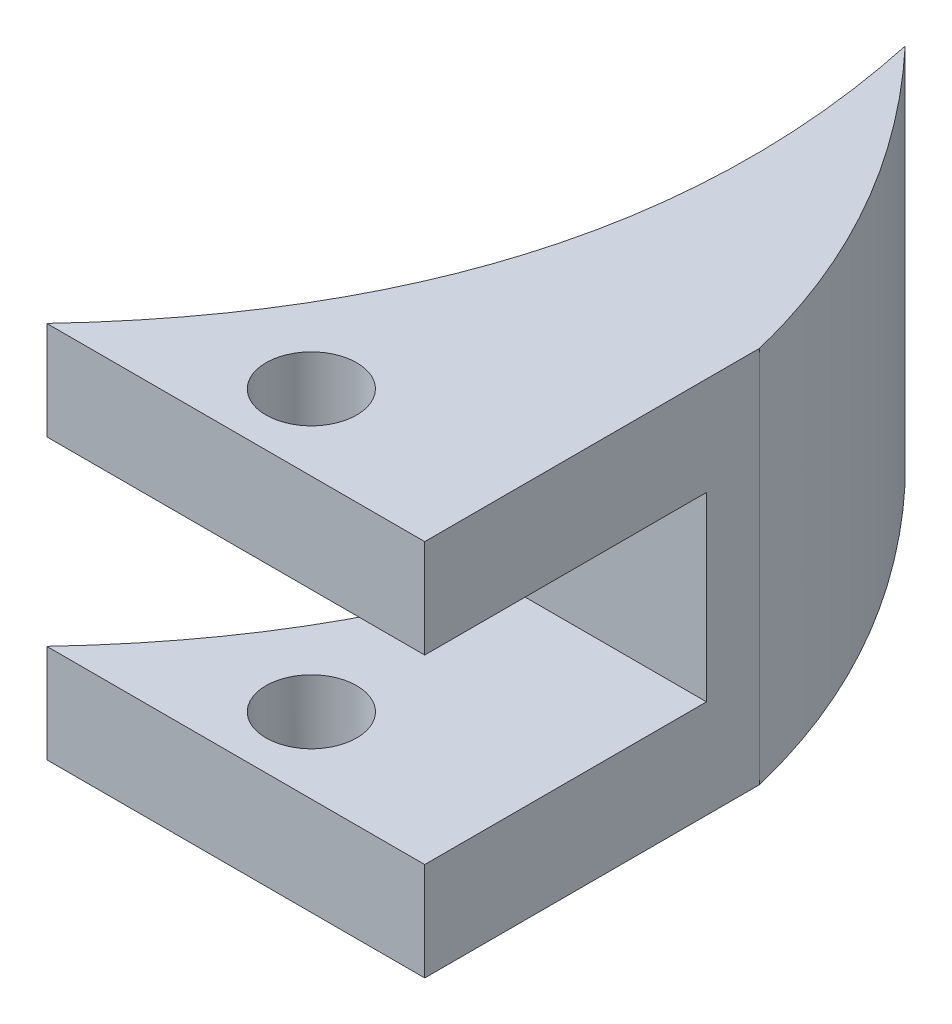
ISO-10303-21;
HEADER;
FILE_DESCRIPTION(('STEP AP214'),'2;1');
FILE_NAME('part.step','',(''),(''),'','','');
FILE_SCHEMA(('AUTOMOTIVE_DESIGN { 1 0 10303 214 1 1 1 1 }'));
ENDSEC;
DATA;
#1=APPLICATION_CONTEXT('core data for automotive mechanical design processes');
#2=APPLICATION_PROTOCOL_DEFINITION('international standard','automotive_design',2000,#1);
#3=PRODUCT_CONTEXT('',#1,'mechanical');
#4=PRODUCT('Part','Part','',(#3));
#5=PRODUCT_RELATED_PRODUCT_CATEGORY('part','',(#4));
#6=PRODUCT_DEFINITION_FORMATION('','',#4);
#7=PRODUCT_DEFINITION_CONTEXT('part definition',#1,'design');
#8=PRODUCT_DEFINITION('design','',#6,#7);
#9=PRODUCT_DEFINITION_SHAPE('','',#8);
#10=(LENGTH_UNIT() NAMED_UNIT(*) SI_UNIT(.MILLI.,.METRE.));
#11=(NAMED_UNIT(*) PLANE_ANGLE_UNIT() SI_UNIT($,.RADIAN.));
#12=(NAMED_UNIT(*) SI_UNIT($,.STERADIAN.) SOLID_ANGLE_UNIT());
#13=UNCERTAINTY_MEASURE_WITH_UNIT(LENGTH_MEASURE(1.E-05),#10,'distance_accuracy_value','');
#14=(GEOMETRIC_REPRESENTATION_CONTEXT(3) GLOBAL_UNCERTAINTY_ASSIGNED_CONTEXT((#13)) GLOBAL_UNIT_ASSIGNED_CONTEXT((#10,
#11,#12)) REPRESENTATION_CONTEXT('',''));
#15=CARTESIAN_POINT('',(0.,0.,0.));
#16=DIRECTION('',(0.,0.,1.));
#17=DIRECTION('',(1.,0.,0.));
#18=AXIS2_PLACEMENT_3D('',#15,#16,#17);
#19=CARTESIAN_POINT('',(0.,0.,44.2841737858594));
#20=DIRECTION('',(0.,0.,-1.));
#21=DIRECTION('',(-1.,0.,0.));
#22=AXIS2_PLACEMENT_3D('',#19,#20,#21);
#23=PLANE('',#22);
#24=DIRECTION('',(0.,1.,0.));
#25=VECTOR('',#24,1.);
#26=CARTESIAN_POINT('',(-12.5,-12.5,44.2841737858594));
#27=LINE('',#26,#25);
#28=CARTESIAN_POINT('',(-12.5,6.,44.2841737858594));
#29=VERTEX_POINT('',#28);
#30=CARTESIAN_POINT('',(-12.5,12.5,44.2841737858594));
#31=VERTEX_POINT('',#30);
#32=EDGE_CURVE('E115',#29,#31,#27,.T.);
#33=ORIENTED_EDGE('',*,*,#32,.F.);
#34=DIRECTION('',(-1.,0.,0.));
#35=VECTOR('',#34,1.);
#36=CARTESIAN_POINT('',(12.5,6.,44.2841737858594));
#37=LINE('',#36,#35);
#38=CARTESIAN_POINT('',(12.5,6.,44.2841737858594));
#39=VERTEX_POINT('',#38);
#40=EDGE_CURVE('E167',#39,#29,#37,.T.);
#41=ORIENTED_EDGE('',*,*,#40,.F.);
#42=DIRECTION('',(0.,1.,0.));
#43=VECTOR('',#42,1.);
#44=CARTESIAN_POINT('',(12.5,-12.5,44.2841737858594));
#45=LINE('',#44,#43);
#46=CARTESIAN_POINT('',(12.5,12.5,44.2841737858594));
#47=VERTEX_POINT('',#46);
#48=EDGE_CURVE('E192',#39,#47,#45,.T.);
#49=ORIENTED_EDGE('',*,*,#48,.T.);
#50=DIRECTION('',(1.,0.,0.));
#51=VECTOR('',#50,1.);
#52=CARTESIAN_POINT('',(-12.5,12.5,44.2841737858594));
#53=LINE('',#52,#51);
#54=EDGE_CURVE('E190',#31,#47,#53,.T.);
#55=ORIENTED_EDGE('',*,*,#54,.F.);
#56=EDGE_LOOP('',(#33,#41,#49,#55));
#57=FACE_BOUND('',#56,.T.);
#58=ADVANCED_FACE('F36',(#57),#23,.F.);
#59=CARTESIAN_POINT('',(0.,-23.9068454263108,39.2841737858594));
#60=DIRECTION('',(0.,1.,0.));
#61=DIRECTION('',(0.,0.,1.));
#62=AXIS2_PLACEMENT_3D('',#59,#60,#61);
#63=CYLINDRICAL_SURFACE('',#62,3.);
#64=CARTESIAN_POINT('',(0.,6.,39.2841737858594));
#65=DIRECTION('',(0.,1.,0.));
#66=DIRECTION('',(0.,0.,1.));
#67=AXIS2_PLACEMENT_3D('',#64,#65,#66);
#68=CIRCLE('',#67,3.);
#69=CARTESIAN_POINT('',(0.,6.,42.2841737858594));
#70=VERTEX_POINT('',#69);
#71=EDGE_CURVE('E185',#70,#70,#68,.F.);
#72=ORIENTED_EDGE('',*,*,#71,.T.);
#73=EDGE_LOOP('',(#72));
#74=FACE_BOUND('',#73,.T.);
#75=CARTESIAN_POINT('',(0.,12.5,39.2841737858594));
#76=DIRECTION('',(0.,1.,0.));
#77=DIRECTION('',(0.,0.,1.));
#78=AXIS2_PLACEMENT_3D('',#75,#76,#77);
#79=CIRCLE('',#78,3.);
#80=CARTESIAN_POINT('',(0.,12.5,42.2841737858594));
#81=VERTEX_POINT('',#80);
#82=EDGE_CURVE('E181',#81,#81,#79,.T.);
#83=ORIENTED_EDGE('',*,*,#82,.T.);
#84=EDGE_LOOP('',(#83));
#85=FACE_BOUND('',#84,.T.);
#86=ADVANCED_FACE('F203',(#74,#85),#63,.F.);
#87=CARTESIAN_POINT('',(-12.5,-12.5,44.2841737858594));
#88=DIRECTION('',(0.,1.,0.));
#89=DIRECTION('',(0.,0.,1.));
#90=AXIS2_PLACEMENT_3D('',#87,#88,#89);
#91=PLANE('',#90);
#92=CARTESIAN_POINT('',(0.,-12.5,39.2841737858594));
#93=DIRECTION('',(0.,1.,0.));
#94=DIRECTION('',(0.,0.,1.));
#95=AXIS2_PLACEMENT_3D('',#92,#93,#94);
#96=CIRCLE('',#95,3.);
#97=CARTESIAN_POINT('',(0.,-12.5,42.2841737858594));
#98=VERTEX_POINT('',#97);
#99=EDGE_CURVE('E184',#98,#98,#96,.T.);
#100=ORIENTED_EDGE('',*,*,#99,.T.);
#101=EDGE_LOOP('',(#100));
#102=FACE_BOUND('',#101,.T.);
#103=DIRECTION('',(1.,0.,0.));
#104=VECTOR('',#103,1.);
#105=CARTESIAN_POINT('',(-12.5,-12.5,44.2841737858594));
#106=LINE('',#105,#104);
#107=CARTESIAN_POINT('',(-12.5,-12.5,44.2841737858594));
#108=VERTEX_POINT('',#107);
#109=CARTESIAN_POINT('',(12.5,-12.5,44.2841737858594));
#110=VERTEX_POINT('',#109);
#111=EDGE_CURVE('E58',#108,#110,#106,.T.);
#112=ORIENTED_EDGE('',*,*,#111,.F.);
#113=CARTESIAN_POINT('',(-12.5,-12.5,44.2841737858594));
#114=CARTESIAN_POINT('',(5.44260617674752,-12.5,25.2146327436583));
#115=CARTESIAN_POINT('',(0.,-12.5,0.));
#116=B_SPLINE_CURVE_WITH_KNOTS('',2,(#113,#114,#115),.UNSPECIFIED.,.F.,.F.,(3,3),(0.,1.),.UNSPECIFIED.);
#117=CARTESIAN_POINT('',(0.,-12.5,0.));
#118=VERTEX_POINT('',#117);
#119=EDGE_CURVE('E145',#108,#118,#116,.T.);
#120=ORIENTED_EDGE('',*,*,#119,.T.);
#121=CARTESIAN_POINT('',(0.,-12.5,0.));
#122=CARTESIAN_POINT('',(17.9426061767475,-12.5,19.069541042201));
#123=CARTESIAN_POINT('',(12.5,-12.5,44.2841737858594));
#124=B_SPLINE_CURVE_WITH_KNOTS('',2,(#121,#122,#123),.UNSPECIFIED.,.F.,.F.,(3,3),(0.,1.),.UNSPECIFIED.);
#125=CARTESIAN_POINT('',(12.5,-12.5,22.1420868929297));
#126=VERTEX_POINT('',#125);
#127=EDGE_CURVE('E108',#118,#126,#124,.T.);
#128=ORIENTED_EDGE('',*,*,#127,.T.);
#129=DIRECTION('',(0.,0.,-1.));
#130=VECTOR('',#129,1.);
#131=CARTESIAN_POINT('',(12.5,-12.5,44.2841737858594));
#132=LINE('',#131,#130);
#133=EDGE_CURVE('E44',#110,#126,#132,.T.);
#134=ORIENTED_EDGE('',*,*,#133,.F.);
#135=EDGE_LOOP('',(#112,#120,#128,#134));
#136=FACE_BOUND('',#135,.T.);
#137=ADVANCED_FACE('F229',(#102,#136),#91,.F.);
#138=CARTESIAN_POINT('',(12.5,-12.5,44.2841737858594));
#139=DIRECTION('',(-1.,0.,0.));
#140=DIRECTION('',(0.,0.,1.));
#141=AXIS2_PLACEMENT_3D('',#138,#139,#140);
#142=PLANE('',#141);
#143=ORIENTED_EDGE('',*,*,#133,.T.);
#144=DIRECTION('',(0.,1.,0.));
#145=VECTOR('',#144,1.);
#146=CARTESIAN_POINT('',(12.5,-27.5,22.1420868929297));
#147=LINE('',#146,#145);
#148=CARTESIAN_POINT('',(12.5000000195082,12.5,22.142086973055));
#149=VERTEX_POINT('',#148);
#150=EDGE_CURVE('E152',#126,#149,#147,.T.);
#151=ORIENTED_EDGE('',*,*,#150,.T.);
#152=DIRECTION('',(0.,0.,-1.));
#153=VECTOR('',#152,1.);
#154=CARTESIAN_POINT('',(12.5,12.5,44.2841737858594));
#155=LINE('',#154,#153);
#156=EDGE_CURVE('E123',#47,#149,#155,.T.);
#157=ORIENTED_EDGE('',*,*,#156,.F.);
#158=ORIENTED_EDGE('',*,*,#48,.F.);
#159=DIRECTION('',(0.,0.,1.));
#160=VECTOR('',#159,1.);
#161=CARTESIAN_POINT('',(12.5,6.,25.6443389602607));
#162=LINE('',#161,#160);
#163=CARTESIAN_POINT('',(12.5,6.,25.6443389602607));
#164=VERTEX_POINT('',#163);
#165=EDGE_CURVE('E176',#164,#39,#162,.T.);
#166=ORIENTED_EDGE('',*,*,#165,.F.);
#167=DIRECTION('',(0.,1.,0.));
#168=VECTOR('',#167,1.);
#169=CARTESIAN_POINT('',(12.5,-6.,25.6443389602607));
#170=LINE('',#169,#168);
#171=CARTESIAN_POINT('',(12.5,-6.,25.6443389602607));
#172=VERTEX_POINT('',#171);
#173=EDGE_CURVE('E166',#172,#164,#170,.T.);
#174=ORIENTED_EDGE('',*,*,#173,.F.);
#175=DIRECTION('',(0.,0.,1.));
#176=VECTOR('',#175,1.);
#177=CARTESIAN_POINT('',(12.5,-6.,25.6443389602607));
#178=LINE('',#177,#176);
#179=CARTESIAN_POINT('',(12.5,-6.,44.2841737858594));
#180=VERTEX_POINT('',#179);
#181=EDGE_CURVE('E172',#172,#180,#178,.T.);
#182=ORIENTED_EDGE('',*,*,#181,.T.);
#183=EDGE_CURVE('E193',#110,#180,#45,.T.);
#184=ORIENTED_EDGE('',*,*,#183,.F.);
#185=EDGE_LOOP('',(#143,#151,#157,#158,#166,#174,#182,#184));
#186=FACE_BOUND('',#185,.T.);
#187=ADVANCED_FACE('F235',(#186),#142,.F.);
#188=CARTESIAN_POINT('',(-12.5,12.5,44.2841737858594));
#189=DIRECTION('',(0.,1.,0.));
#190=DIRECTION('',(0.,0.,1.));
#191=AXIS2_PLACEMENT_3D('',#188,#189,#190);
#192=PLANE('',#191);
#193=CARTESIAN_POINT('',(-12.5,12.5,44.2841737858594));
#194=CARTESIAN_POINT('',(5.44260617674752,12.5,25.2146327436583));
#195=CARTESIAN_POINT('',(0.,12.5,0.));
#196=B_SPLINE_CURVE_WITH_KNOTS('',2,(#193,#194,#195),.UNSPECIFIED.,.F.,.F.,(3,3),(0.,1.),.UNSPECIFIED.);
#197=CARTESIAN_POINT('',(0.,12.5,0.));
#198=VERTEX_POINT('',#197);
#199=EDGE_CURVE('E112',#31,#198,#196,.T.);
#200=ORIENTED_EDGE('',*,*,#199,.F.);
#201=ORIENTED_EDGE('',*,*,#54,.T.);
#202=ORIENTED_EDGE('',*,*,#156,.T.);
#203=CARTESIAN_POINT('',(0.,12.5,0.));
#204=CARTESIAN_POINT('',(17.9426061767475,12.5,19.069541042201));
#205=CARTESIAN_POINT('',(12.5,12.5,44.2841737858594));
#206=B_SPLINE_CURVE_WITH_KNOTS('',2,(#203,#204,#205),.UNSPECIFIED.,.F.,.F.,(3,3),(0.,1.),.UNSPECIFIED.);
#207=EDGE_CURVE('E105',#198,#149,#206,.T.);
#208=ORIENTED_EDGE('',*,*,#207,.F.);
#209=EDGE_LOOP('',(#200,#201,#202,#208));
#210=FACE_BOUND('',#209,.T.);
#211=ORIENTED_EDGE('',*,*,#82,.F.);
#212=EDGE_LOOP('',(#211));
#213=FACE_BOUND('',#212,.T.);
#214=ADVANCED_FACE('F38',(#210,#213),#192,.T.);
#215=ORIENTED_EDGE('',*,*,#183,.T.);
#216=DIRECTION('',(1.,0.,0.));
#217=VECTOR('',#216,1.);
#218=CARTESIAN_POINT('',(12.5,-6.,44.2841737858594));
#219=LINE('',#218,#217);
#220=CARTESIAN_POINT('',(-12.5,-6.,44.2841737858594));
#221=VERTEX_POINT('',#220);
#222=EDGE_CURVE('E160',#221,#180,#219,.T.);
#223=ORIENTED_EDGE('',*,*,#222,.F.);
#224=EDGE_CURVE('E188',#108,#221,#27,.T.);
#225=ORIENTED_EDGE('',*,*,#224,.F.);
#226=ORIENTED_EDGE('',*,*,#111,.T.);
#227=EDGE_LOOP('',(#215,#223,#225,#226));
#228=FACE_BOUND('',#227,.T.);
#229=ADVANCED_FACE('F219',(#228),#23,.F.);
#230=CARTESIAN_POINT('',(0.,-6.,39.2841737858594));
#231=DIRECTION('',(0.,-1.,0.));
#232=DIRECTION('',(0.,0.,-1.));
#233=AXIS2_PLACEMENT_3D('',#230,#231,#232);
#234=CIRCLE('',#233,3.);
#235=CARTESIAN_POINT('',(0.,-6.,36.2841737858594));
#236=VERTEX_POINT('',#235);
#237=EDGE_CURVE('E178',#236,#236,#234,.F.);
#238=ORIENTED_EDGE('',*,*,#237,.T.);
#239=EDGE_LOOP('',(#238));
#240=FACE_BOUND('',#239,.T.);
#241=ORIENTED_EDGE('',*,*,#99,.F.);
#242=EDGE_LOOP('',(#241));
#243=FACE_BOUND('',#242,.T.);
#244=ADVANCED_FACE('F209',(#240,#243),#63,.F.);
#245=CARTESIAN_POINT('',(12.5,6.,25.6443389602607));
#246=DIRECTION('',(0.,1.,0.));
#247=DIRECTION('',(0.,0.,1.));
#248=AXIS2_PLACEMENT_3D('',#245,#246,#247);
#249=PLANE('',#248);
#250=ORIENTED_EDGE('',*,*,#40,.T.);
#251=CARTESIAN_POINT('',(-12.5,6.,44.2841737858594));
#252=CARTESIAN_POINT('',(5.44260617674752,6.,25.2146327436583));
#253=CARTESIAN_POINT('',(0.,6.,0.));
#254=B_SPLINE_CURVE_WITH_KNOTS('',2,(#251,#252,#253),.UNSPECIFIED.,.F.,.F.,(3,3),(0.,1.),.UNSPECIFIED.);
#255=CARTESIAN_POINT('',(-1.00875734571659,6.,25.6443389602607));
#256=VERTEX_POINT('',#255);
#257=EDGE_CURVE('E137',#29,#256,#254,.T.);
#258=ORIENTED_EDGE('',*,*,#257,.T.);
#259=DIRECTION('',(-1.,0.,0.));
#260=VECTOR('',#259,1.);
#261=CARTESIAN_POINT('',(12.5,6.,25.6443389602607));
#262=LINE('',#261,#260);
#263=EDGE_CURVE('E169',#164,#256,#262,.T.);
#264=ORIENTED_EDGE('',*,*,#263,.F.);
#265=ORIENTED_EDGE('',*,*,#165,.T.);
#266=EDGE_LOOP('',(#250,#258,#264,#265));
#267=FACE_BOUND('',#266,.T.);
#268=ORIENTED_EDGE('',*,*,#71,.F.);
#269=EDGE_LOOP('',(#268));
#270=FACE_BOUND('',#269,.T.);
#271=ADVANCED_FACE('F206',(#267,#270),#249,.F.);
#272=CARTESIAN_POINT('',(12.5,-6.,25.6443389602607));
#273=DIRECTION('',(0.,-1.,0.));
#274=DIRECTION('',(0.,0.,-1.));
#275=AXIS2_PLACEMENT_3D('',#272,#273,#274);
#276=PLANE('',#275);
#277=DIRECTION('',(1.,0.,0.));
#278=VECTOR('',#277,1.);
#279=CARTESIAN_POINT('',(12.5,-6.,25.6443389602607));
#280=LINE('',#279,#278);
#281=CARTESIAN_POINT('',(-1.00875734571658,-6.,25.6443389602607));
#282=VERTEX_POINT('',#281);
#283=EDGE_CURVE('E161',#282,#172,#280,.T.);
#284=ORIENTED_EDGE('',*,*,#283,.F.);
#285=CARTESIAN_POINT('',(-12.5,-6.,44.2841737858594));
#286=CARTESIAN_POINT('',(5.44260617674752,-6.,25.2146327436583));
#287=CARTESIAN_POINT('',(0.,-6.,0.));
#288=B_SPLINE_CURVE_WITH_KNOTS('',2,(#285,#286,#287),.UNSPECIFIED.,.F.,.F.,(3,3),(0.,1.),.UNSPECIFIED.);
#289=EDGE_CURVE('E50',#282,#221,#288,.F.);
#290=ORIENTED_EDGE('',*,*,#289,.T.);
#291=ORIENTED_EDGE('',*,*,#222,.T.);
#292=ORIENTED_EDGE('',*,*,#181,.F.);
#293=EDGE_LOOP('',(#284,#290,#291,#292));
#294=FACE_BOUND('',#293,.T.);
#295=ORIENTED_EDGE('',*,*,#237,.F.);
#296=EDGE_LOOP('',(#295));
#297=FACE_BOUND('',#296,.T.);
#298=ADVANCED_FACE('F208',(#294,#297),#276,.F.);
#299=CARTESIAN_POINT('',(0.,0.,25.6443389602607));
#300=DIRECTION('',(0.,0.,1.));
#301=DIRECTION('',(1.,0.,0.));
#302=AXIS2_PLACEMENT_3D('',#299,#300,#301);
#303=PLANE('',#302);
#304=DIRECTION('',(0.,1.,0.));
#305=VECTOR('',#304,1.);
#306=CARTESIAN_POINT('',(-1.00875734571659,-27.5,25.6443389602607));
#307=LINE('',#306,#305);
#308=EDGE_CURVE('E11',#282,#256,#307,.T.);
#309=ORIENTED_EDGE('',*,*,#308,.F.);
#310=ORIENTED_EDGE('',*,*,#283,.T.);
#311=ORIENTED_EDGE('',*,*,#173,.T.);
#312=ORIENTED_EDGE('',*,*,#263,.T.);
#313=EDGE_LOOP('',(#309,#310,#311,#312));
#314=FACE_BOUND('',#313,.T.);
#315=ADVANCED_FACE('F216',(#314),#303,.T.);
#316=CARTESIAN_POINT('',(0.,-27.5,0.));
#317=CARTESIAN_POINT('',(17.9426061767475,-27.5,19.069541042201));
#318=CARTESIAN_POINT('',(12.5,-27.5,44.2841737858594));
#319=B_SPLINE_CURVE_WITH_KNOTS('',2,(#316,#317,#318),.UNSPECIFIED.,.F.,.F.,(3,3),(0.,1.),.UNSPECIFIED.);
#320=DIRECTION('',(0.,1.,0.));
#321=VECTOR('',#320,1.);
#322=SURFACE_OF_LINEAR_EXTRUSION('',#319,#321);
#323=DIRECTION('',(0.,1.,0.));
#324=VECTOR('',#323,1.);
#325=CARTESIAN_POINT('',(0.,-27.5,0.));
#326=LINE('',#325,#324);
#327=EDGE_CURVE('E101',#118,#198,#326,.T.);
#328=ORIENTED_EDGE('',*,*,#327,.T.);
#329=ORIENTED_EDGE('',*,*,#207,.T.);
#330=ORIENTED_EDGE('',*,*,#150,.F.);
#331=ORIENTED_EDGE('',*,*,#127,.F.);
#332=EDGE_LOOP('',(#328,#329,#330,#331));
#333=FACE_BOUND('',#332,.T.);
#334=ADVANCED_FACE('F103',(#333),#322,.F.);
#335=CARTESIAN_POINT('',(-12.5,-27.5,44.2841737858594));
#336=CARTESIAN_POINT('',(5.44260617674752,-27.5,25.2146327436583));
#337=CARTESIAN_POINT('',(0.,-27.5,0.));
#338=B_SPLINE_CURVE_WITH_KNOTS('',2,(#335,#336,#337),.UNSPECIFIED.,.F.,.F.,(3,3),(0.,1.),.UNSPECIFIED.);
#339=DIRECTION('',(0.,1.,0.));
#340=VECTOR('',#339,1.);
#341=SURFACE_OF_LINEAR_EXTRUSION('',#338,#340);
#342=ORIENTED_EDGE('',*,*,#224,.T.);
#343=ORIENTED_EDGE('',*,*,#289,.F.);
#344=ORIENTED_EDGE('',*,*,#308,.T.);
#345=ORIENTED_EDGE('',*,*,#257,.F.);
#346=ORIENTED_EDGE('',*,*,#32,.T.);
#347=ORIENTED_EDGE('',*,*,#199,.T.);
#348=ORIENTED_EDGE('',*,*,#327,.F.);
#349=ORIENTED_EDGE('',*,*,#119,.F.);
#350=EDGE_LOOP('',(#342,#343,#344,#345,#346,#347,#348,#349));
#351=FACE_BOUND('',#350,.T.);
#352=ADVANCED_FACE('F113',(#351),#341,.F.);
#353=CLOSED_SHELL('',(#58,#86,#137,#187,#214,#229,#244,#271,#298,#315,#334,#352));
#354=MANIFOLD_SOLID_BREP('B2',#353);
#355=ADVANCED_BREP_SHAPE_REPRESENTATION('',(#18,#354),#14);
#356=SHAPE_DEFINITION_REPRESENTATION(#9,#355);
ENDSEC;
END-ISO-10303-21;
